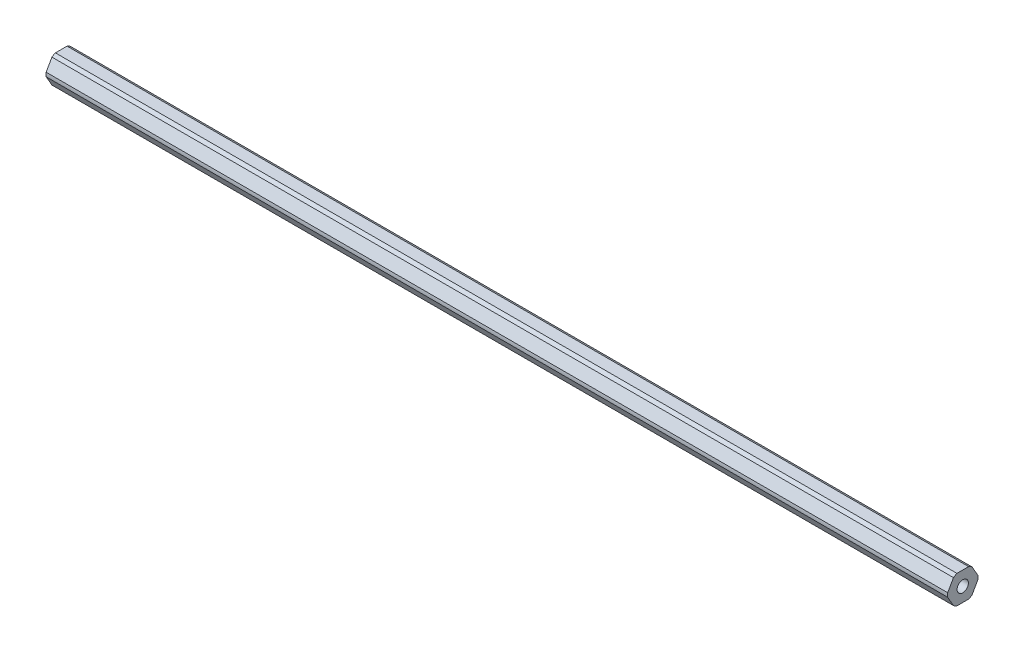
ISO-10303-21;
HEADER;
FILE_DESCRIPTION(('STEP AP214'),'2;1');
FILE_NAME('part.step','',(''),(''),'','','');
FILE_SCHEMA(('AUTOMOTIVE_DESIGN { 1 0 10303 214 1 1 1 1 }'));
ENDSEC;
DATA;
#1=APPLICATION_CONTEXT('core data for automotive mechanical design processes');
#2=APPLICATION_PROTOCOL_DEFINITION('international standard','automotive_design',2000,#1);
#3=PRODUCT_CONTEXT('',#1,'mechanical');
#4=PRODUCT('Part','Part','',(#3));
#5=PRODUCT_RELATED_PRODUCT_CATEGORY('part','',(#4));
#6=PRODUCT_DEFINITION_FORMATION('','',#4);
#7=PRODUCT_DEFINITION_CONTEXT('part definition',#1,'design');
#8=PRODUCT_DEFINITION('design','',#6,#7);
#9=PRODUCT_DEFINITION_SHAPE('','',#8);
#10=(LENGTH_UNIT() NAMED_UNIT(*) SI_UNIT(.MILLI.,.METRE.));
#11=(NAMED_UNIT(*) PLANE_ANGLE_UNIT() SI_UNIT($,.RADIAN.));
#12=(NAMED_UNIT(*) SI_UNIT($,.STERADIAN.) SOLID_ANGLE_UNIT());
#13=UNCERTAINTY_MEASURE_WITH_UNIT(LENGTH_MEASURE(1.E-05),#10,'distance_accuracy_value','');
#14=(GEOMETRIC_REPRESENTATION_CONTEXT(3) GLOBAL_UNCERTAINTY_ASSIGNED_CONTEXT((#13)) GLOBAL_UNIT_ASSIGNED_CONTEXT((#10,
#11,#12)) REPRESENTATION_CONTEXT('',''));
#15=CARTESIAN_POINT('',(0.,0.,0.));
#16=DIRECTION('',(0.,0.,1.));
#17=DIRECTION('',(1.,0.,0.));
#18=AXIS2_PLACEMENT_3D('',#15,#16,#17);
#19=CARTESIAN_POINT('',(482.6,-92.0747265172785,705.700265));
#20=DIRECTION('',(0.,-0.5,0.86602540378444));
#21=DIRECTION('',(0.,-0.86602540378444,-0.5));
#22=AXIS2_PLACEMENT_3D('',#19,#20,#21);
#23=PLANE('',#22);
#24=DIRECTION('',(-1.,0.,0.));
#25=VECTOR('',#24,1.);
#26=CARTESIAN_POINT('',(482.6,-94.3555451597344,704.383433742805));
#27=LINE('',#26,#25);
#28=CARTESIAN_POINT('',(482.6,-94.3555451597344,704.383433742805));
#29=VERTEX_POINT('',#28);
#30=CARTESIAN_POINT('',(76.2,-94.3555451597343,704.383433742805));
#31=VERTEX_POINT('',#30);
#32=EDGE_CURVE('E164',#29,#31,#27,.T.);
#33=ORIENTED_EDGE('',*,*,#32,.T.);
#34=DIRECTION('',(0.,-0.866025403784436,-0.5));
#35=VECTOR('',#34,1.);
#36=CARTESIAN_POINT('',(76.2,-92.0747265172784,705.700265));
#37=LINE('',#36,#35);
#38=CARTESIAN_POINT('',(76.2,-89.7939078748224,707.017096257195));
#39=VERTEX_POINT('',#38);
#40=EDGE_CURVE('E135',#39,#31,#37,.T.);
#41=ORIENTED_EDGE('',*,*,#40,.F.);
#42=DIRECTION('',(-1.,0.,0.));
#43=VECTOR('',#42,1.);
#44=CARTESIAN_POINT('',(482.6,-89.7939078748224,707.017096257195));
#45=LINE('',#44,#43);
#46=CARTESIAN_POINT('',(482.6,-89.7939078748224,707.017096257195));
#47=VERTEX_POINT('',#46);
#48=EDGE_CURVE('E166',#39,#47,#45,.F.);
#49=ORIENTED_EDGE('',*,*,#48,.T.);
#50=DIRECTION('',(0.,0.86602540378444,0.5));
#51=VECTOR('',#50,1.);
#52=CARTESIAN_POINT('',(482.6,-92.0747265172785,705.700265));
#53=LINE('',#52,#51);
#54=EDGE_CURVE('E172',#29,#47,#53,.T.);
#55=ORIENTED_EDGE('',*,*,#54,.F.);
#56=EDGE_LOOP('',(#33,#41,#49,#55));
#57=FACE_BOUND('',#56,.T.);
#58=ADVANCED_FACE('F17',(#57),#23,.F.);
#59=CARTESIAN_POINT('',(482.6,-88.8994530345568,711.2));
#60=DIRECTION('',(0.,-1.,0.));
#61=DIRECTION('',(0.,0.,-1.));
#62=AXIS2_PLACEMENT_3D('',#59,#60,#61);
#63=PLANE('',#62);
#64=DIRECTION('',(-1.,0.,0.));
#65=VECTOR('',#64,1.);
#66=CARTESIAN_POINT('',(482.6,-88.8994530345568,708.566337485611));
#67=LINE('',#66,#65);
#68=CARTESIAN_POINT('',(482.6,-88.8994530345568,708.566337485611));
#69=VERTEX_POINT('',#68);
#70=CARTESIAN_POINT('',(76.2,-88.8994530345568,708.566337485611));
#71=VERTEX_POINT('',#70);
#72=EDGE_CURVE('E116',#69,#71,#67,.T.);
#73=ORIENTED_EDGE('',*,*,#72,.T.);
#74=DIRECTION('',(0.,0.,-1.));
#75=VECTOR('',#74,1.);
#76=CARTESIAN_POINT('',(76.2,-88.8994530345568,711.2));
#77=LINE('',#76,#75);
#78=CARTESIAN_POINT('',(76.2,-88.8994530345568,713.833662514389));
#79=VERTEX_POINT('',#78);
#80=EDGE_CURVE('E132',#79,#71,#77,.T.);
#81=ORIENTED_EDGE('',*,*,#80,.F.);
#82=DIRECTION('',(-1.,0.,0.));
#83=VECTOR('',#82,1.);
#84=CARTESIAN_POINT('',(482.6,-88.8994530345568,713.833662514389));
#85=LINE('',#84,#83);
#86=CARTESIAN_POINT('',(482.6,-88.8994530345568,713.833662514389));
#87=VERTEX_POINT('',#86);
#88=EDGE_CURVE('E161',#79,#87,#85,.F.);
#89=ORIENTED_EDGE('',*,*,#88,.T.);
#90=DIRECTION('',(0.,0.,1.));
#91=VECTOR('',#90,1.);
#92=CARTESIAN_POINT('',(482.6,-88.8994530345568,711.2));
#93=LINE('',#92,#91);
#94=EDGE_CURVE('E175',#69,#87,#93,.T.);
#95=ORIENTED_EDGE('',*,*,#94,.F.);
#96=EDGE_LOOP('',(#73,#81,#89,#95));
#97=FACE_BOUND('',#96,.T.);
#98=ADVANCED_FACE('F225',(#97),#63,.F.);
#99=CARTESIAN_POINT('',(482.6,-92.0747265172783,716.699735));
#100=DIRECTION('',(0.,-0.5,-0.86602540378444));
#101=DIRECTION('',(0.,0.86602540378444,-0.5));
#102=AXIS2_PLACEMENT_3D('',#99,#100,#101);
#103=PLANE('',#102);
#104=DIRECTION('',(-1.,0.,0.));
#105=VECTOR('',#104,1.);
#106=CARTESIAN_POINT('',(482.6,-89.7939078748224,715.382903742805));
#107=LINE('',#106,#105);
#108=CARTESIAN_POINT('',(482.6,-89.7939078748225,715.382903742805));
#109=VERTEX_POINT('',#108);
#110=CARTESIAN_POINT('',(76.2,-89.7939078748225,715.382903742805));
#111=VERTEX_POINT('',#110);
#112=EDGE_CURVE('E117',#109,#111,#107,.T.);
#113=ORIENTED_EDGE('',*,*,#112,.T.);
#114=DIRECTION('',(0.,0.86602540378444,-0.5));
#115=VECTOR('',#114,1.);
#116=CARTESIAN_POINT('',(76.2,-92.0747265172783,716.699735));
#117=LINE('',#116,#115);
#118=CARTESIAN_POINT('',(76.2,-94.3555451597343,718.016566257195));
#119=VERTEX_POINT('',#118);
#120=EDGE_CURVE('E123',#119,#111,#117,.T.);
#121=ORIENTED_EDGE('',*,*,#120,.F.);
#122=DIRECTION('',(-1.,0.,0.));
#123=VECTOR('',#122,1.);
#124=CARTESIAN_POINT('',(482.6,-94.3555451597343,718.016566257195));
#125=LINE('',#124,#123);
#126=CARTESIAN_POINT('',(482.6,-94.3555451597343,718.016566257195));
#127=VERTEX_POINT('',#126);
#128=EDGE_CURVE('E105',#119,#127,#125,.F.);
#129=ORIENTED_EDGE('',*,*,#128,.T.);
#130=DIRECTION('',(0.,-0.86602540378444,0.5));
#131=VECTOR('',#130,1.);
#132=CARTESIAN_POINT('',(482.6,-92.0747265172783,716.699735));
#133=LINE('',#132,#131);
#134=EDGE_CURVE('E178',#109,#127,#133,.T.);
#135=ORIENTED_EDGE('',*,*,#134,.F.);
#136=EDGE_LOOP('',(#113,#121,#129,#135));
#137=FACE_BOUND('',#136,.T.);
#138=ADVANCED_FACE('F130',(#137),#103,.F.);
#139=CARTESIAN_POINT('',(482.6,-98.4252734827217,716.699735));
#140=DIRECTION('',(0.,0.5,-0.86602540378444));
#141=DIRECTION('',(0.,0.86602540378444,0.5));
#142=AXIS2_PLACEMENT_3D('',#139,#140,#141);
#143=PLANE('',#142);
#144=DIRECTION('',(-1.,0.,0.));
#145=VECTOR('',#144,1.);
#146=CARTESIAN_POINT('',(482.6,-96.1444548402657,718.016566257195));
#147=LINE('',#146,#145);
#148=CARTESIAN_POINT('',(482.6,-96.1444548402657,718.016566257195));
#149=VERTEX_POINT('',#148);
#150=CARTESIAN_POINT('',(76.2,-96.1444548402657,718.016566257195));
#151=VERTEX_POINT('',#150);
#152=EDGE_CURVE('E154',#149,#151,#147,.T.);
#153=ORIENTED_EDGE('',*,*,#152,.T.);
#154=DIRECTION('',(0.,0.86602540378444,0.5));
#155=VECTOR('',#154,1.);
#156=CARTESIAN_POINT('',(76.2,-98.4252734827217,716.699735));
#157=LINE('',#156,#155);
#158=CARTESIAN_POINT('',(76.2,-100.706092125177,715.382903742805));
#159=VERTEX_POINT('',#158);
#160=EDGE_CURVE('E126',#159,#151,#157,.T.);
#161=ORIENTED_EDGE('',*,*,#160,.F.);
#162=DIRECTION('',(-1.,0.,0.));
#163=VECTOR('',#162,1.);
#164=CARTESIAN_POINT('',(482.6,-100.706092125178,715.382903742805));
#165=LINE('',#164,#163);
#166=CARTESIAN_POINT('',(482.6,-100.706092125177,715.382903742805));
#167=VERTEX_POINT('',#166);
#168=EDGE_CURVE('E156',#159,#167,#165,.F.);
#169=ORIENTED_EDGE('',*,*,#168,.T.);
#170=DIRECTION('',(0.,-0.86602540378444,-0.5));
#171=VECTOR('',#170,1.);
#172=CARTESIAN_POINT('',(482.6,-98.4252734827217,716.699735));
#173=LINE('',#172,#171);
#174=EDGE_CURVE('E180',#149,#167,#173,.T.);
#175=ORIENTED_EDGE('',*,*,#174,.F.);
#176=EDGE_LOOP('',(#153,#161,#169,#175));
#177=FACE_BOUND('',#176,.T.);
#178=ADVANCED_FACE('F230',(#177),#143,.F.);
#179=CARTESIAN_POINT('',(482.6,-101.600546965443,711.2));
#180=DIRECTION('',(0.,1.,0.));
#181=DIRECTION('',(0.,0.,1.));
#182=AXIS2_PLACEMENT_3D('',#179,#180,#181);
#183=PLANE('',#182);
#184=DIRECTION('',(-1.,0.,0.));
#185=VECTOR('',#184,1.);
#186=CARTESIAN_POINT('',(482.6,-101.600546965443,713.833662514389));
#187=LINE('',#186,#185);
#188=CARTESIAN_POINT('',(482.6,-101.600546965443,713.833662514389));
#189=VERTEX_POINT('',#188);
#190=CARTESIAN_POINT('',(76.2,-101.600546965443,713.833662514389));
#191=VERTEX_POINT('',#190);
#192=EDGE_CURVE('E149',#189,#191,#187,.T.);
#193=ORIENTED_EDGE('',*,*,#192,.T.);
#194=DIRECTION('',(0.,0.,1.));
#195=VECTOR('',#194,1.);
#196=CARTESIAN_POINT('',(76.2,-101.600546965443,711.2));
#197=LINE('',#196,#195);
#198=CARTESIAN_POINT('',(76.2,-101.600546965443,708.566337485611));
#199=VERTEX_POINT('',#198);
#200=EDGE_CURVE('E137',#199,#191,#197,.T.);
#201=ORIENTED_EDGE('',*,*,#200,.F.);
#202=DIRECTION('',(-1.,0.,0.));
#203=VECTOR('',#202,1.);
#204=CARTESIAN_POINT('',(482.6,-101.600546965443,708.566337485611));
#205=LINE('',#204,#203);
#206=CARTESIAN_POINT('',(482.6,-101.600546965443,708.566337485611));
#207=VERTEX_POINT('',#206);
#208=EDGE_CURVE('E151',#199,#207,#205,.F.);
#209=ORIENTED_EDGE('',*,*,#208,.T.);
#210=DIRECTION('',(0.,0.,-1.));
#211=VECTOR('',#210,1.);
#212=CARTESIAN_POINT('',(482.6,-101.600546965443,711.2));
#213=LINE('',#212,#211);
#214=EDGE_CURVE('E24',#189,#207,#213,.T.);
#215=ORIENTED_EDGE('',*,*,#214,.F.);
#216=EDGE_LOOP('',(#193,#201,#209,#215));
#217=FACE_BOUND('',#216,.T.);
#218=ADVANCED_FACE('F190',(#217),#183,.F.);
#219=CARTESIAN_POINT('',(482.6,-98.4252734827216,705.700265));
#220=DIRECTION('',(0.,0.5,0.866025403784436));
#221=DIRECTION('',(0.,-0.866025403784436,0.5));
#222=AXIS2_PLACEMENT_3D('',#219,#220,#221);
#223=PLANE('',#222);
#224=DIRECTION('',(-1.,0.,0.));
#225=VECTOR('',#224,1.);
#226=CARTESIAN_POINT('',(482.6,-100.706092125178,707.017096257195));
#227=LINE('',#226,#225);
#228=CARTESIAN_POINT('',(482.6,-100.706092125178,707.017096257195));
#229=VERTEX_POINT('',#228);
#230=CARTESIAN_POINT('',(76.2,-100.706092125178,707.017096257195));
#231=VERTEX_POINT('',#230);
#232=EDGE_CURVE('E39',#229,#231,#227,.T.);
#233=ORIENTED_EDGE('',*,*,#232,.T.);
#234=DIRECTION('',(0.,-0.86602540378444,0.5));
#235=VECTOR('',#234,1.);
#236=CARTESIAN_POINT('',(76.2,-98.4252734827216,705.700265));
#237=LINE('',#236,#235);
#238=CARTESIAN_POINT('',(76.2,-96.1444548402656,704.383433742805));
#239=VERTEX_POINT('',#238);
#240=EDGE_CURVE('E200',#239,#231,#237,.T.);
#241=ORIENTED_EDGE('',*,*,#240,.F.);
#242=DIRECTION('',(-1.,0.,0.));
#243=VECTOR('',#242,1.);
#244=CARTESIAN_POINT('',(482.6,-96.1444548402657,704.383433742805));
#245=LINE('',#244,#243);
#246=CARTESIAN_POINT('',(482.6,-96.1444548402657,704.383433742805));
#247=VERTEX_POINT('',#246);
#248=EDGE_CURVE('E147',#239,#247,#245,.F.);
#249=ORIENTED_EDGE('',*,*,#248,.T.);
#250=DIRECTION('',(0.,0.866025403784436,-0.5));
#251=VECTOR('',#250,1.);
#252=CARTESIAN_POINT('',(482.6,-98.4252734827216,705.700265));
#253=LINE('',#252,#251);
#254=EDGE_CURVE('E11',#229,#247,#253,.T.);
#255=ORIENTED_EDGE('',*,*,#254,.F.);
#256=EDGE_LOOP('',(#233,#241,#249,#255));
#257=FACE_BOUND('',#256,.T.);
#258=ADVANCED_FACE('F219',(#257),#223,.F.);
#259=CARTESIAN_POINT('',(482.6,-95.25,711.2));
#260=DIRECTION('',(1.,0.,0.));
#261=DIRECTION('',(0.,0.,-1.));
#262=AXIS2_PLACEMENT_3D('',#259,#260,#261);
#263=PLANE('',#262);
#264=CARTESIAN_POINT('',(482.6,-95.25,711.2));
#265=DIRECTION('',(1.,0.,0.));
#266=DIRECTION('',(0.,0.,-1.));
#267=AXIS2_PLACEMENT_3D('',#264,#265,#266);
#268=CIRCLE('',#267,2.55269999999996);
#269=CARTESIAN_POINT('',(482.6,-95.25,708.6473));
#270=VERTEX_POINT('',#269);
#271=EDGE_CURVE('E169',#270,#270,#268,.T.);
#272=ORIENTED_EDGE('',*,*,#271,.F.);
#273=EDGE_LOOP('',(#272));
#274=FACE_BOUND('',#273,.T.);
#275=ORIENTED_EDGE('',*,*,#54,.T.);
#276=CARTESIAN_POINT('',(482.6,-95.25,711.2));
#277=DIRECTION('',(1.,0.,0.));
#278=DIRECTION('',(0.,0.,-1.));
#279=AXIS2_PLACEMENT_3D('',#276,#277,#278);
#280=CIRCLE('',#279,6.875);
#281=EDGE_CURVE('E145',#47,#69,#280,.T.);
#282=ORIENTED_EDGE('',*,*,#281,.T.);
#283=ORIENTED_EDGE('',*,*,#94,.T.);
#284=EDGE_CURVE('E223',#87,#109,#280,.T.);
#285=ORIENTED_EDGE('',*,*,#284,.T.);
#286=ORIENTED_EDGE('',*,*,#134,.T.);
#287=EDGE_CURVE('E111',#127,#149,#280,.T.);
#288=ORIENTED_EDGE('',*,*,#287,.T.);
#289=ORIENTED_EDGE('',*,*,#174,.T.);
#290=EDGE_CURVE('E188',#167,#189,#280,.T.);
#291=ORIENTED_EDGE('',*,*,#290,.T.);
#292=ORIENTED_EDGE('',*,*,#214,.T.);
#293=EDGE_CURVE('E144',#207,#229,#280,.T.);
#294=ORIENTED_EDGE('',*,*,#293,.T.);
#295=ORIENTED_EDGE('',*,*,#254,.T.);
#296=EDGE_CURVE('E31',#247,#29,#280,.T.);
#297=ORIENTED_EDGE('',*,*,#296,.T.);
#298=EDGE_LOOP('',(#275,#282,#283,#285,#286,#288,#289,#291,#292,#294,#295,#297));
#299=FACE_BOUND('',#298,.T.);
#300=ADVANCED_FACE('F186',(#274,#299),#263,.T.);
#301=CARTESIAN_POINT('',(482.6,-95.25,711.2));
#302=DIRECTION('',(-1.,0.,0.));
#303=DIRECTION('',(0.,0.,1.));
#304=AXIS2_PLACEMENT_3D('',#301,#302,#303);
#305=CYLINDRICAL_SURFACE('',#304,2.55269999999996);
#306=ORIENTED_EDGE('',*,*,#271,.T.);
#307=EDGE_LOOP('',(#306));
#308=FACE_BOUND('',#307,.T.);
#309=CARTESIAN_POINT('',(76.2,-95.25,711.2));
#310=DIRECTION('',(-1.,0.,0.));
#311=DIRECTION('',(0.,0.,1.));
#312=AXIS2_PLACEMENT_3D('',#309,#310,#311);
#313=CIRCLE('',#312,2.55269999999996);
#314=CARTESIAN_POINT('',(76.2,-95.25,713.7527));
#315=VERTEX_POINT('',#314);
#316=EDGE_CURVE('E204',#315,#315,#313,.T.);
#317=ORIENTED_EDGE('',*,*,#316,.T.);
#318=EDGE_LOOP('',(#317));
#319=FACE_BOUND('',#318,.T.);
#320=ADVANCED_FACE('F244',(#308,#319),#305,.F.);
#321=CARTESIAN_POINT('',(482.6,-95.25,711.2));
#322=DIRECTION('',(-1.,0.,0.));
#323=DIRECTION('',(0.,0.,1.));
#324=AXIS2_PLACEMENT_3D('',#321,#322,#323);
#325=CYLINDRICAL_SURFACE('',#324,6.875);
#326=ORIENTED_EDGE('',*,*,#208,.F.);
#327=CARTESIAN_POINT('',(76.2,-95.25,711.2));
#328=DIRECTION('',(-1.,0.,0.));
#329=DIRECTION('',(0.,0.,1.));
#330=AXIS2_PLACEMENT_3D('',#327,#328,#329);
#331=CIRCLE('',#330,6.875);
#332=EDGE_CURVE('E196',#231,#199,#331,.T.);
#333=ORIENTED_EDGE('',*,*,#332,.F.);
#334=ORIENTED_EDGE('',*,*,#232,.F.);
#335=ORIENTED_EDGE('',*,*,#293,.F.);
#336=EDGE_LOOP('',(#326,#333,#334,#335));
#337=FACE_BOUND('',#336,.T.);
#338=ADVANCED_FACE('F195',(#337),#325,.T.);
#339=ORIENTED_EDGE('',*,*,#296,.F.);
#340=ORIENTED_EDGE('',*,*,#248,.F.);
#341=EDGE_CURVE('E201',#31,#239,#331,.T.);
#342=ORIENTED_EDGE('',*,*,#341,.F.);
#343=ORIENTED_EDGE('',*,*,#32,.F.);
#344=EDGE_LOOP('',(#339,#340,#342,#343));
#345=FACE_BOUND('',#344,.T.);
#346=ADVANCED_FACE('F217',(#345),#325,.T.);
#347=ORIENTED_EDGE('',*,*,#168,.F.);
#348=EDGE_CURVE('E127',#191,#159,#331,.T.);
#349=ORIENTED_EDGE('',*,*,#348,.F.);
#350=ORIENTED_EDGE('',*,*,#192,.F.);
#351=ORIENTED_EDGE('',*,*,#290,.F.);
#352=EDGE_LOOP('',(#347,#349,#350,#351));
#353=FACE_BOUND('',#352,.T.);
#354=ADVANCED_FACE('F232',(#353),#325,.T.);
#355=ORIENTED_EDGE('',*,*,#128,.F.);
#356=EDGE_CURVE('E108',#151,#119,#331,.T.);
#357=ORIENTED_EDGE('',*,*,#356,.F.);
#358=ORIENTED_EDGE('',*,*,#152,.F.);
#359=ORIENTED_EDGE('',*,*,#287,.F.);
#360=EDGE_LOOP('',(#355,#357,#358,#359));
#361=FACE_BOUND('',#360,.T.);
#362=ADVANCED_FACE('F107',(#361),#325,.T.);
#363=ORIENTED_EDGE('',*,*,#88,.F.);
#364=EDGE_CURVE('E129',#111,#79,#331,.T.);
#365=ORIENTED_EDGE('',*,*,#364,.F.);
#366=ORIENTED_EDGE('',*,*,#112,.F.);
#367=ORIENTED_EDGE('',*,*,#284,.F.);
#368=EDGE_LOOP('',(#363,#365,#366,#367));
#369=FACE_BOUND('',#368,.T.);
#370=ADVANCED_FACE('F227',(#369),#325,.T.);
#371=ORIENTED_EDGE('',*,*,#48,.F.);
#372=EDGE_CURVE('E202',#71,#39,#331,.T.);
#373=ORIENTED_EDGE('',*,*,#372,.F.);
#374=ORIENTED_EDGE('',*,*,#72,.F.);
#375=ORIENTED_EDGE('',*,*,#281,.F.);
#376=EDGE_LOOP('',(#371,#373,#374,#375));
#377=FACE_BOUND('',#376,.T.);
#378=ADVANCED_FACE('F240',(#377),#325,.T.);
#379=CARTESIAN_POINT('',(76.2,-95.25,711.2));
#380=DIRECTION('',(-1.,0.,0.));
#381=DIRECTION('',(0.,0.,-1.));
#382=AXIS2_PLACEMENT_3D('',#379,#380,#381);
#383=PLANE('',#382);
#384=ORIENTED_EDGE('',*,*,#316,.F.);
#385=EDGE_LOOP('',(#384));
#386=FACE_BOUND('',#385,.T.);
#387=ORIENTED_EDGE('',*,*,#120,.T.);
#388=ORIENTED_EDGE('',*,*,#364,.T.);
#389=ORIENTED_EDGE('',*,*,#80,.T.);
#390=ORIENTED_EDGE('',*,*,#372,.T.);
#391=ORIENTED_EDGE('',*,*,#40,.T.);
#392=ORIENTED_EDGE('',*,*,#341,.T.);
#393=ORIENTED_EDGE('',*,*,#240,.T.);
#394=ORIENTED_EDGE('',*,*,#332,.T.);
#395=ORIENTED_EDGE('',*,*,#200,.T.);
#396=ORIENTED_EDGE('',*,*,#348,.T.);
#397=ORIENTED_EDGE('',*,*,#160,.T.);
#398=ORIENTED_EDGE('',*,*,#356,.T.);
#399=EDGE_LOOP('',(#387,#388,#389,#390,#391,#392,#393,#394,#395,#396,#397,#398));
#400=FACE_BOUND('',#399,.T.);
#401=ADVANCED_FACE('F121',(#386,#400),#383,.T.);
#402=CLOSED_SHELL('',(#58,#98,#138,#178,#218,#258,#300,#320,#338,#346,#354,#362,#370,#378,#401));
#403=MANIFOLD_SOLID_BREP('B1',#402);
#404=ADVANCED_BREP_SHAPE_REPRESENTATION('',(#18,#403),#14);
#405=SHAPE_DEFINITION_REPRESENTATION(#9,#404);
ENDSEC;
END-ISO-10303-21;
